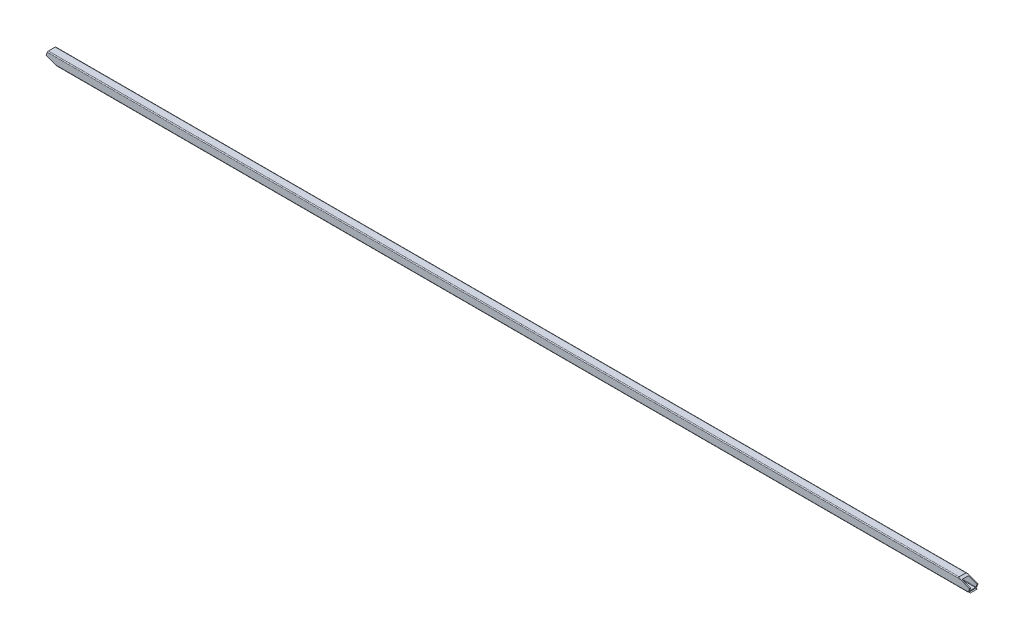
ISO-10303-21;
HEADER;
FILE_DESCRIPTION(('STEP AP214'),'2;1');
FILE_NAME('part.step','',(''),(''),'','','');
FILE_SCHEMA(('AUTOMOTIVE_DESIGN { 1 0 10303 214 1 1 1 1 }'));
ENDSEC;
DATA;
#1=APPLICATION_CONTEXT('core data for automotive mechanical design processes');
#2=APPLICATION_PROTOCOL_DEFINITION('international standard','automotive_design',2000,#1);
#3=PRODUCT_CONTEXT('',#1,'mechanical');
#4=PRODUCT('Part','Part','',(#3));
#5=PRODUCT_RELATED_PRODUCT_CATEGORY('part','',(#4));
#6=PRODUCT_DEFINITION_FORMATION('','',#4);
#7=PRODUCT_DEFINITION_CONTEXT('part definition',#1,'design');
#8=PRODUCT_DEFINITION('design','',#6,#7);
#9=PRODUCT_DEFINITION_SHAPE('','',#8);
#10=(LENGTH_UNIT() NAMED_UNIT(*) SI_UNIT(.MILLI.,.METRE.));
#11=(NAMED_UNIT(*) PLANE_ANGLE_UNIT() SI_UNIT($,.RADIAN.));
#12=(NAMED_UNIT(*) SI_UNIT($,.STERADIAN.) SOLID_ANGLE_UNIT());
#13=UNCERTAINTY_MEASURE_WITH_UNIT(LENGTH_MEASURE(1.E-05),#10,'distance_accuracy_value','');
#14=(GEOMETRIC_REPRESENTATION_CONTEXT(3) GLOBAL_UNCERTAINTY_ASSIGNED_CONTEXT((#13)) GLOBAL_UNIT_ASSIGNED_CONTEXT((#10,
#11,#12)) REPRESENTATION_CONTEXT('',''));
#15=CARTESIAN_POINT('',(0.,0.,0.));
#16=DIRECTION('',(0.,0.,1.));
#17=DIRECTION('',(1.,0.,0.));
#18=AXIS2_PLACEMENT_3D('',#15,#16,#17);
#19=CARTESIAN_POINT('',(-2786.03,12.7,-12.7));
#20=DIRECTION('',(0.,0.,-1.));
#21=DIRECTION('',(0.,1.,0.));
#22=AXIS2_PLACEMENT_3D('',#19,#20,#21);
#23=PLANE('',#22);
#24=DIRECTION('',(1.,0.,0.));
#25=VECTOR('',#24,1.);
#26=CARTESIAN_POINT('',(-2786.03,-10.2,-12.7));
#27=LINE('',#26,#25);
#28=CARTESIAN_POINT('',(-3.7406225324993,-10.2,-12.7));
#29=VERTEX_POINT('',#28);
#30=CARTESIAN_POINT('',(-2758.70655373482,-10.2000000000002,-12.7));
#31=VERTEX_POINT('',#30);
#32=EDGE_CURVE('E142',#29,#31,#27,.F.);
#33=ORIENTED_EDGE('',*,*,#32,.T.);
#34=DIRECTION('',(0.9366721892484,-0.350207381259461,0.));
#35=VECTOR('',#34,1.);
#36=CARTESIAN_POINT('',(-341.688045351741,-913.886190315629,-12.7));
#37=LINE('',#36,#35);
#38=CARTESIAN_POINT('',(-2786.03,0.0158179492779128,-12.7));
#39=VERTEX_POINT('',#38);
#40=EDGE_CURVE('E359',#39,#31,#37,.T.);
#41=ORIENTED_EDGE('',*,*,#40,.F.);
#42=DIRECTION('',(0.350207381259481,0.936672189248393,0.));
#43=VECTOR('',#42,1.);
#44=CARTESIAN_POINT('',(-2444.34195464822,913.902008264952,-12.7));
#45=LINE('',#44,#43);
#46=CARTESIAN_POINT('',(-2782.22229035815,10.2,-12.7));
#47=VERTEX_POINT('',#46);
#48=EDGE_CURVE('E320',#39,#47,#45,.T.);
#49=ORIENTED_EDGE('',*,*,#48,.T.);
#50=DIRECTION('',(1.,0.,0.));
#51=VECTOR('',#50,1.);
#52=CARTESIAN_POINT('',(-2786.03,10.2,-12.7));
#53=LINE('',#52,#51);
#54=CARTESIAN_POINT('',(-27.238832210926,10.2000000000001,-12.7));
#55=VERTEX_POINT('',#54);
#56=EDGE_CURVE('E158',#47,#55,#53,.T.);
#57=ORIENTED_EDGE('',*,*,#56,.T.);
#58=DIRECTION('',(-0.9366721892484,0.350207381259461,0.));
#59=VECTOR('',#58,1.);
#60=CARTESIAN_POINT('',(0.0051887542219442,0.0138779535687158,-12.7));
#61=LINE('',#60,#59);
#62=CARTESIAN_POINT('',(0.,0.0158179492779128,-12.7));
#63=VERTEX_POINT('',#62);
#64=EDGE_CURVE('E150',#63,#55,#61,.T.);
#65=ORIENTED_EDGE('',*,*,#64,.F.);
#66=DIRECTION('',(-0.343835113469539,-0.939030039320036,0.));
#67=VECTOR('',#66,1.);
#68=CARTESIAN_POINT('',(-0.00510716501219618,0.00187003885706116,-12.7));
#69=LINE('',#68,#67);
#70=EDGE_CURVE('E130',#63,#29,#69,.T.);
#71=ORIENTED_EDGE('',*,*,#70,.T.);
#72=EDGE_LOOP('',(#33,#41,#49,#57,#65,#71));
#73=FACE_BOUND('',#72,.T.);
#74=ADVANCED_FACE('F49',(#73),#23,.T.);
#75=CARTESIAN_POINT('',(-2786.03,12.7,12.7));
#76=DIRECTION('',(0.,0.,1.));
#77=DIRECTION('',(0.,-1.,0.));
#78=AXIS2_PLACEMENT_3D('',#75,#76,#77);
#79=PLANE('',#78);
#80=DIRECTION('',(0.350207381259481,0.936672189248393,0.));
#81=VECTOR('',#80,1.);
#82=CARTESIAN_POINT('',(-2444.34195464822,913.902008264952,12.7));
#83=LINE('',#82,#81);
#84=CARTESIAN_POINT('',(-2786.03,0.0158179492779128,12.7));
#85=VERTEX_POINT('',#84);
#86=CARTESIAN_POINT('',(-2782.22229035815,10.2,12.7));
#87=VERTEX_POINT('',#86);
#88=EDGE_CURVE('E324',#85,#87,#83,.T.);
#89=ORIENTED_EDGE('',*,*,#88,.F.);
#90=DIRECTION('',(0.9366721892484,-0.350207381259461,0.));
#91=VECTOR('',#90,1.);
#92=CARTESIAN_POINT('',(-341.688045351741,-913.886190315629,12.7));
#93=LINE('',#92,#91);
#94=CARTESIAN_POINT('',(-2758.70655373482,-10.2000000000002,12.7));
#95=VERTEX_POINT('',#94);
#96=EDGE_CURVE('E360',#85,#95,#93,.T.);
#97=ORIENTED_EDGE('',*,*,#96,.T.);
#98=DIRECTION('',(1.,0.,0.));
#99=VECTOR('',#98,1.);
#100=CARTESIAN_POINT('',(-2786.03,-10.2,12.7));
#101=LINE('',#100,#99);
#102=CARTESIAN_POINT('',(-3.7406225324993,-10.2,12.7));
#103=VERTEX_POINT('',#102);
#104=EDGE_CURVE('E258',#95,#103,#101,.T.);
#105=ORIENTED_EDGE('',*,*,#104,.T.);
#106=DIRECTION('',(-0.343835113469539,-0.939030039320036,0.));
#107=VECTOR('',#106,1.);
#108=CARTESIAN_POINT('',(-0.00510716501219618,0.00187003885706116,12.7));
#109=LINE('',#108,#107);
#110=CARTESIAN_POINT('',(0.,0.0158179492779128,12.7));
#111=VERTEX_POINT('',#110);
#112=EDGE_CURVE('E168',#111,#103,#109,.T.);
#113=ORIENTED_EDGE('',*,*,#112,.F.);
#114=DIRECTION('',(-0.9366721892484,0.350207381259461,0.));
#115=VECTOR('',#114,1.);
#116=CARTESIAN_POINT('',(0.0051887542219442,0.0138779535687158,12.7));
#117=LINE('',#116,#115);
#118=CARTESIAN_POINT('',(-27.238832210926,10.2000000000001,12.7));
#119=VERTEX_POINT('',#118);
#120=EDGE_CURVE('E164',#111,#119,#117,.T.);
#121=ORIENTED_EDGE('',*,*,#120,.T.);
#122=DIRECTION('',(1.,0.,0.));
#123=VECTOR('',#122,1.);
#124=CARTESIAN_POINT('',(-2786.03,10.2,12.7));
#125=LINE('',#124,#123);
#126=EDGE_CURVE('E261',#119,#87,#125,.F.);
#127=ORIENTED_EDGE('',*,*,#126,.T.);
#128=EDGE_LOOP('',(#89,#97,#105,#113,#121,#127));
#129=FACE_BOUND('',#128,.T.);
#130=ADVANCED_FACE('F274',(#129),#79,.T.);
#131=CARTESIAN_POINT('',(-2786.03,-9.652,-9.652));
#132=DIRECTION('',(0.,0.,-1.));
#133=DIRECTION('',(-1.,0.,0.));
#134=AXIS2_PLACEMENT_3D('',#131,#132,#133);
#135=PLANE('',#134);
#136=DIRECTION('',(-0.9366721892484,0.350207381259461,0.));
#137=VECTOR('',#136,1.);
#138=CARTESIAN_POINT('',(-2782.85867037187,-1.16989361227622,-9.652));
#139=LINE('',#138,#137);
#140=CARTESIAN_POINT('',(-2762.84686780742,-8.652,-9.652));
#141=VERTEX_POINT('',#140);
#142=CARTESIAN_POINT('',(-2786.03,0.0158179492779128,-9.652));
#143=VERTEX_POINT('',#142);
#144=EDGE_CURVE('E335',#141,#143,#139,.T.);
#145=ORIENTED_EDGE('',*,*,#144,.F.);
#146=DIRECTION('',(1.,0.,0.));
#147=VECTOR('',#146,1.);
#148=CARTESIAN_POINT('',(0.,-8.652,-9.652));
#149=LINE('',#148,#147);
#150=CARTESIAN_POINT('',(-3.17380705976289,-8.652,-9.652));
#151=VERTEX_POINT('',#150);
#152=EDGE_CURVE('E172',#141,#151,#149,.T.);
#153=ORIENTED_EDGE('',*,*,#152,.T.);
#154=DIRECTION('',(0.343835113469539,0.939030039320036,0.));
#155=VECTOR('',#154,1.);
#156=CARTESIAN_POINT('',(-332.493132081083,-908.038731050126,-9.652));
#157=LINE('',#156,#155);
#158=CARTESIAN_POINT('',(0.,0.0158179492779128,-9.652));
#159=VERTEX_POINT('',#158);
#160=EDGE_CURVE('E169',#151,#159,#157,.T.);
#161=ORIENTED_EDGE('',*,*,#160,.T.);
#162=DIRECTION('',(0.9366721892484,-0.350207381259461,0.));
#163=VECTOR('',#162,1.);
#164=CARTESIAN_POINT('',(-2441.16543626591,912.730174656922,-9.652));
#165=LINE('',#164,#163);
#166=CARTESIAN_POINT('',(-23.098518138327,8.652,-9.652));
#167=VERTEX_POINT('',#166);
#168=EDGE_CURVE('E153',#167,#159,#165,.T.);
#169=ORIENTED_EDGE('',*,*,#168,.F.);
#170=DIRECTION('',(1.,0.,0.));
#171=VECTOR('',#170,1.);
#172=CARTESIAN_POINT('',(-2786.03,8.652,-9.652));
#173=LINE('',#172,#171);
#174=CARTESIAN_POINT('',(-2782.80106384199,8.652,-9.652));
#175=VERTEX_POINT('',#174);
#176=EDGE_CURVE('E171',#167,#175,#173,.F.);
#177=ORIENTED_EDGE('',*,*,#176,.T.);
#178=DIRECTION('',(-0.350207381259481,-0.936672189248393,0.));
#179=VECTOR('',#178,1.);
#180=CARTESIAN_POINT('',(-2789.20132962813,-8.46628843844581,-9.652));
#181=LINE('',#180,#179);
#182=EDGE_CURVE('E291',#175,#143,#181,.T.);
#183=ORIENTED_EDGE('',*,*,#182,.T.);
#184=EDGE_LOOP('',(#145,#153,#161,#169,#177,#183));
#185=FACE_BOUND('',#184,.T.);
#186=ADVANCED_FACE('F430',(#185),#135,.F.);
#187=CARTESIAN_POINT('',(-2786.03,-9.652,9.652));
#188=DIRECTION('',(0.,0.,1.));
#189=DIRECTION('',(1.,0.,0.));
#190=AXIS2_PLACEMENT_3D('',#187,#188,#189);
#191=PLANE('',#190);
#192=DIRECTION('',(0.9366721892484,-0.350207381259461,0.));
#193=VECTOR('',#192,1.);
#194=CARTESIAN_POINT('',(-2782.85867037187,-1.16989361227622,9.652));
#195=LINE('',#194,#193);
#196=CARTESIAN_POINT('',(-2786.03,0.0158179492779128,9.65199999999999));
#197=VERTEX_POINT('',#196);
#198=CARTESIAN_POINT('',(-2762.84686780742,-8.652,9.652));
#199=VERTEX_POINT('',#198);
#200=EDGE_CURVE('E343',#197,#199,#195,.T.);
#201=ORIENTED_EDGE('',*,*,#200,.F.);
#202=DIRECTION('',(0.350207381259481,0.936672189248393,0.));
#203=VECTOR('',#202,1.);
#204=CARTESIAN_POINT('',(-2789.20132962813,-8.46628843844581,9.652));
#205=LINE('',#204,#203);
#206=CARTESIAN_POINT('',(-2782.80106384199,8.652,9.652));
#207=VERTEX_POINT('',#206);
#208=EDGE_CURVE('E305',#197,#207,#205,.T.);
#209=ORIENTED_EDGE('',*,*,#208,.T.);
#210=DIRECTION('',(1.,0.,0.));
#211=VECTOR('',#210,1.);
#212=CARTESIAN_POINT('',(0.,8.652,9.652));
#213=LINE('',#212,#211);
#214=CARTESIAN_POINT('',(-23.098518138327,8.652,9.652));
#215=VERTEX_POINT('',#214);
#216=EDGE_CURVE('E229',#207,#215,#213,.T.);
#217=ORIENTED_EDGE('',*,*,#216,.T.);
#218=DIRECTION('',(-0.9366721892484,0.350207381259461,0.));
#219=VECTOR('',#218,1.);
#220=CARTESIAN_POINT('',(-2441.16543626591,912.730174656922,9.652));
#221=LINE('',#220,#219);
#222=CARTESIAN_POINT('',(0.,0.0158179492779128,9.65199999999999));
#223=VERTEX_POINT('',#222);
#224=EDGE_CURVE('E187',#223,#215,#221,.T.);
#225=ORIENTED_EDGE('',*,*,#224,.F.);
#226=DIRECTION('',(-0.343835113469539,-0.939030039320036,0.));
#227=VECTOR('',#226,1.);
#228=CARTESIAN_POINT('',(-332.493132081083,-908.038731050126,9.652));
#229=LINE('',#228,#227);
#230=CARTESIAN_POINT('',(-3.17380705976289,-8.652,9.652));
#231=VERTEX_POINT('',#230);
#232=EDGE_CURVE('E178',#223,#231,#229,.T.);
#233=ORIENTED_EDGE('',*,*,#232,.T.);
#234=DIRECTION('',(1.,0.,0.));
#235=VECTOR('',#234,1.);
#236=CARTESIAN_POINT('',(-2786.03,-8.652,9.652));
#237=LINE('',#236,#235);
#238=EDGE_CURVE('E181',#231,#199,#237,.F.);
#239=ORIENTED_EDGE('',*,*,#238,.T.);
#240=EDGE_LOOP('',(#201,#209,#217,#225,#233,#239));
#241=FACE_BOUND('',#240,.T.);
#242=ADVANCED_FACE('F447',(#241),#191,.F.);
#243=CARTESIAN_POINT('',(-2786.03,-12.7,12.7));
#244=DIRECTION('',(0.,-1.,0.));
#245=DIRECTION('',(0.,0.,-1.));
#246=AXIS2_PLACEMENT_3D('',#243,#244,#245);
#247=PLANE('',#246);
#248=DIRECTION('',(1.,0.,0.));
#249=VECTOR('',#248,1.);
#250=CARTESIAN_POINT('',(-2786.03,-12.7,10.2));
#251=LINE('',#250,#249);
#252=CARTESIAN_POINT('',(-4.65602219777089,-12.7,10.2));
#253=VERTEX_POINT('',#252);
#254=CARTESIAN_POINT('',(-2752.02,-12.7000000000002,10.2));
#255=VERTEX_POINT('',#254);
#256=EDGE_CURVE('E192',#253,#255,#251,.F.);
#257=ORIENTED_EDGE('',*,*,#256,.T.);
#258=DIRECTION('',(0.,0.,1.));
#259=VECTOR('',#258,1.);
#260=CARTESIAN_POINT('',(-2752.02,-12.7000000000002,-12.7));
#261=LINE('',#260,#259);
#262=CARTESIAN_POINT('',(-2752.02,-12.7000000000002,-10.2));
#263=VERTEX_POINT('',#262);
#264=EDGE_CURVE('E355',#263,#255,#261,.T.);
#265=ORIENTED_EDGE('',*,*,#264,.F.);
#266=DIRECTION('',(1.,0.,0.));
#267=VECTOR('',#266,1.);
#268=CARTESIAN_POINT('',(-2786.03,-12.7,-10.2));
#269=LINE('',#268,#267);
#270=CARTESIAN_POINT('',(-4.65602219777089,-12.7,-10.2));
#271=VERTEX_POINT('',#270);
#272=EDGE_CURVE('E67',#263,#271,#269,.T.);
#273=ORIENTED_EDGE('',*,*,#272,.T.);
#274=DIRECTION('',(0.,0.,-1.));
#275=VECTOR('',#274,1.);
#276=CARTESIAN_POINT('',(-4.65602219777139,-12.7,12.7));
#277=LINE('',#276,#275);
#278=EDGE_CURVE('E59',#253,#271,#277,.T.);
#279=ORIENTED_EDGE('',*,*,#278,.F.);
#280=EDGE_LOOP('',(#257,#265,#273,#279));
#281=FACE_BOUND('',#280,.T.);
#282=ADVANCED_FACE('F51',(#281),#247,.T.);
#283=CARTESIAN_POINT('',(-2786.03,-9.652,9.652));
#284=DIRECTION('',(0.,-1.,0.));
#285=DIRECTION('',(0.,0.,-1.));
#286=AXIS2_PLACEMENT_3D('',#283,#284,#285);
#287=PLANE('',#286);
#288=DIRECTION('',(0.,0.,-1.));
#289=VECTOR('',#288,1.);
#290=CARTESIAN_POINT('',(-2760.17224631349,-9.652,9.652));
#291=LINE('',#290,#289);
#292=CARTESIAN_POINT('',(-2760.17224631349,-9.652,8.652));
#293=VERTEX_POINT('',#292);
#294=CARTESIAN_POINT('',(-2760.17224631349,-9.652,-8.652));
#295=VERTEX_POINT('',#294);
#296=EDGE_CURVE('E347',#293,#295,#291,.T.);
#297=ORIENTED_EDGE('',*,*,#296,.F.);
#298=DIRECTION('',(1.,0.,0.));
#299=VECTOR('',#298,1.);
#300=CARTESIAN_POINT('',(0.,-9.652,8.652));
#301=LINE('',#300,#299);
#302=CARTESIAN_POINT('',(-3.53996692587166,-9.652,8.652));
#303=VERTEX_POINT('',#302);
#304=EDGE_CURVE('E185',#293,#303,#301,.T.);
#305=ORIENTED_EDGE('',*,*,#304,.T.);
#306=DIRECTION('',(0.,0.,-1.));
#307=VECTOR('',#306,1.);
#308=CARTESIAN_POINT('',(-3.53996692587177,-9.652,9.652));
#309=LINE('',#308,#307);
#310=CARTESIAN_POINT('',(-3.53996692587177,-9.652,-8.652));
#311=VERTEX_POINT('',#310);
#312=EDGE_CURVE('E182',#303,#311,#309,.T.);
#313=ORIENTED_EDGE('',*,*,#312,.T.);
#314=DIRECTION('',(1.,0.,0.));
#315=VECTOR('',#314,1.);
#316=CARTESIAN_POINT('',(-2786.03,-9.652,-8.652));
#317=LINE('',#316,#315);
#318=EDGE_CURVE('E177',#311,#295,#317,.F.);
#319=ORIENTED_EDGE('',*,*,#318,.T.);
#320=EDGE_LOOP('',(#297,#305,#313,#319));
#321=FACE_BOUND('',#320,.T.);
#322=ADVANCED_FACE('F439',(#321),#287,.F.);
#323=CARTESIAN_POINT('',(-2786.03,-10.2,-10.2));
#324=DIRECTION('',(1.,0.,0.));
#325=DIRECTION('',(0.,0.,-1.));
#326=AXIS2_PLACEMENT_3D('',#323,#324,#325);
#327=CYLINDRICAL_SURFACE('',#326,2.5);
#328=ORIENTED_EDGE('',*,*,#272,.F.);
#329=CARTESIAN_POINT('',(-2758.70655373482,-10.2,-10.2));
#330=DIRECTION('',(-0.350207381259461,-0.9366721892484,0.));
#331=DIRECTION('',(0.9366721892484,-0.350207381259461,0.));
#332=AXIS2_PLACEMENT_3D('',#329,#330,#331);
#333=ELLIPSE('',#332,7.13862737846694,2.5);
#334=EDGE_CURVE('E326',#263,#31,#333,.F.);
#335=ORIENTED_EDGE('',*,*,#334,.T.);
#336=ORIENTED_EDGE('',*,*,#32,.F.);
#337=CARTESIAN_POINT('',(-3.74062253249896,-10.2,-10.2));
#338=DIRECTION('',(-0.939030039320036,0.343835113469539,0.));
#339=DIRECTION('',(0.343835113469539,0.939030039320036,0.));
#340=AXIS2_PLACEMENT_3D('',#337,#338,#339);
#341=ELLIPSE('',#340,2.66232164607884,2.5);
#342=EDGE_CURVE('E137',#271,#29,#341,.F.);
#343=ORIENTED_EDGE('',*,*,#342,.F.);
#344=EDGE_LOOP('',(#328,#335,#336,#343));
#345=FACE_BOUND('',#344,.T.);
#346=ADVANCED_FACE('F378',(#345),#327,.T.);
#347=CARTESIAN_POINT('',(-2786.03,-10.2,10.2));
#348=DIRECTION('',(1.,0.,0.));
#349=DIRECTION('',(0.,0.,-1.));
#350=AXIS2_PLACEMENT_3D('',#347,#348,#349);
#351=CYLINDRICAL_SURFACE('',#350,2.5);
#352=ORIENTED_EDGE('',*,*,#104,.F.);
#353=CARTESIAN_POINT('',(-2758.70655373482,-10.2,10.2));
#354=DIRECTION('',(-0.350207381259461,-0.9366721892484,0.));
#355=DIRECTION('',(0.9366721892484,-0.350207381259461,0.));
#356=AXIS2_PLACEMENT_3D('',#353,#354,#355);
#357=ELLIPSE('',#356,7.13862737846694,2.5);
#358=EDGE_CURVE('E332',#95,#255,#357,.F.);
#359=ORIENTED_EDGE('',*,*,#358,.T.);
#360=ORIENTED_EDGE('',*,*,#256,.F.);
#361=CARTESIAN_POINT('',(-3.74062253249896,-10.2,10.2));
#362=DIRECTION('',(-0.939030039320036,0.343835113469539,0.));
#363=DIRECTION('',(0.343835113469539,0.939030039320036,0.));
#364=AXIS2_PLACEMENT_3D('',#361,#362,#363);
#365=ELLIPSE('',#364,2.66232164607884,2.5);
#366=EDGE_CURVE('E166',#103,#253,#365,.F.);
#367=ORIENTED_EDGE('',*,*,#366,.F.);
#368=EDGE_LOOP('',(#352,#359,#360,#367));
#369=FACE_BOUND('',#368,.T.);
#370=ADVANCED_FACE('F467',(#369),#351,.T.);
#371=CARTESIAN_POINT('',(-2786.03,-8.652,-8.652));
#372=DIRECTION('',(-1.,0.,0.));
#373=DIRECTION('',(0.,0.,1.));
#374=AXIS2_PLACEMENT_3D('',#371,#372,#373);
#375=CYLINDRICAL_SURFACE('',#374,1.);
#376=CARTESIAN_POINT('',(-2762.84686780742,-8.652,-8.652));
#377=DIRECTION('',(-0.350207381259461,-0.9366721892484,0.));
#378=DIRECTION('',(-0.9366721892484,0.350207381259461,0.));
#379=AXIS2_PLACEMENT_3D('',#376,#377,#378);
#380=ELLIPSE('',#379,2.85545095138677,1.);
#381=EDGE_CURVE('E339',#295,#141,#380,.F.);
#382=ORIENTED_EDGE('',*,*,#381,.F.);
#383=ORIENTED_EDGE('',*,*,#318,.F.);
#384=CARTESIAN_POINT('',(-3.17380705976289,-8.652,-8.652));
#385=DIRECTION('',(-0.939030039320036,0.343835113469539,0.));
#386=DIRECTION('',(-0.343835113469539,-0.939030039320036,0.));
#387=AXIS2_PLACEMENT_3D('',#384,#385,#386);
#388=ELLIPSE('',#387,1.06492865843154,1.);
#389=EDGE_CURVE('E173',#311,#151,#388,.F.);
#390=ORIENTED_EDGE('',*,*,#389,.T.);
#391=ORIENTED_EDGE('',*,*,#152,.F.);
#392=EDGE_LOOP('',(#382,#383,#390,#391));
#393=FACE_BOUND('',#392,.T.);
#394=ADVANCED_FACE('F436',(#393),#375,.F.);
#395=CARTESIAN_POINT('',(-2786.03,-8.652,8.652));
#396=DIRECTION('',(-1.,0.,0.));
#397=DIRECTION('',(0.,0.,1.));
#398=AXIS2_PLACEMENT_3D('',#395,#396,#397);
#399=CYLINDRICAL_SURFACE('',#398,1.);
#400=CARTESIAN_POINT('',(-2762.84686780742,-8.652,8.652));
#401=DIRECTION('',(-0.350207381259461,-0.9366721892484,0.));
#402=DIRECTION('',(-0.9366721892484,0.350207381259461,0.));
#403=AXIS2_PLACEMENT_3D('',#400,#401,#402);
#404=ELLIPSE('',#403,2.85545095138677,1.);
#405=EDGE_CURVE('E351',#199,#293,#404,.F.);
#406=ORIENTED_EDGE('',*,*,#405,.F.);
#407=ORIENTED_EDGE('',*,*,#238,.F.);
#408=CARTESIAN_POINT('',(-3.17380705976289,-8.652,8.652));
#409=DIRECTION('',(-0.939030039320036,0.343835113469539,0.));
#410=DIRECTION('',(-0.343835113469539,-0.939030039320036,0.));
#411=AXIS2_PLACEMENT_3D('',#408,#409,#410);
#412=ELLIPSE('',#411,1.06492865843154,1.);
#413=EDGE_CURVE('E176',#231,#303,#412,.F.);
#414=ORIENTED_EDGE('',*,*,#413,.T.);
#415=ORIENTED_EDGE('',*,*,#304,.F.);
#416=EDGE_LOOP('',(#406,#407,#414,#415));
#417=FACE_BOUND('',#416,.T.);
#418=ADVANCED_FACE('F444',(#417),#399,.F.);
#419=CARTESIAN_POINT('',(-2786.03,12.7,12.7));
#420=DIRECTION('',(0.,1.,0.));
#421=DIRECTION('',(0.,0.,1.));
#422=AXIS2_PLACEMENT_3D('',#419,#420,#421);
#423=PLANE('',#422);
#424=DIRECTION('',(0.,0.,1.));
#425=VECTOR('',#424,1.);
#426=CARTESIAN_POINT('',(-2781.28757865944,12.6999999999999,-12.7));
#427=LINE('',#426,#425);
#428=CARTESIAN_POINT('',(-2781.28757865944,12.6999999999999,-10.2));
#429=VERTEX_POINT('',#428);
#430=CARTESIAN_POINT('',(-2781.28757865944,12.6999999999999,10.2));
#431=VERTEX_POINT('',#430);
#432=EDGE_CURVE('E318',#429,#431,#427,.T.);
#433=ORIENTED_EDGE('',*,*,#432,.T.);
#434=DIRECTION('',(1.,0.,0.));
#435=VECTOR('',#434,1.);
#436=CARTESIAN_POINT('',(-2786.03,12.7,10.2));
#437=LINE('',#436,#435);
#438=CARTESIAN_POINT('',(-33.9253859457433,12.7,10.2));
#439=VERTEX_POINT('',#438);
#440=EDGE_CURVE('E255',#431,#439,#437,.T.);
#441=ORIENTED_EDGE('',*,*,#440,.T.);
#442=DIRECTION('',(0.,0.,-1.));
#443=VECTOR('',#442,1.);
#444=CARTESIAN_POINT('',(-33.9253859457433,12.7,12.7));
#445=LINE('',#444,#443);
#446=CARTESIAN_POINT('',(-33.9253859457433,12.7,-10.2));
#447=VERTEX_POINT('',#446);
#448=EDGE_CURVE('E211',#439,#447,#445,.T.);
#449=ORIENTED_EDGE('',*,*,#448,.T.);
#450=DIRECTION('',(1.,0.,0.));
#451=VECTOR('',#450,1.);
#452=CARTESIAN_POINT('',(-2786.03,12.7,-10.2));
#453=LINE('',#452,#451);
#454=EDGE_CURVE('E248',#447,#429,#453,.F.);
#455=ORIENTED_EDGE('',*,*,#454,.T.);
#456=EDGE_LOOP('',(#433,#441,#449,#455));
#457=FACE_BOUND('',#456,.T.);
#458=ADVANCED_FACE('F485',(#457),#423,.T.);
#459=CARTESIAN_POINT('',(-2786.03,9.652,9.652));
#460=DIRECTION('',(0.,1.,0.));
#461=DIRECTION('',(0.,0.,1.));
#462=AXIS2_PLACEMENT_3D('',#459,#460,#461);
#463=PLANE('',#462);
#464=DIRECTION('',(1.,0.,0.));
#465=VECTOR('',#464,1.);
#466=CARTESIAN_POINT('',(-2786.03,9.652,8.652));
#467=LINE('',#466,#465);
#468=CARTESIAN_POINT('',(-25.7731396322538,9.652,8.652));
#469=VERTEX_POINT('',#468);
#470=CARTESIAN_POINT('',(-2782.42717916251,9.652,8.652));
#471=VERTEX_POINT('',#470);
#472=EDGE_CURVE('E232',#469,#471,#467,.F.);
#473=ORIENTED_EDGE('',*,*,#472,.T.);
#474=DIRECTION('',(0.,0.,-1.));
#475=VECTOR('',#474,1.);
#476=CARTESIAN_POINT('',(-2782.42717916251,9.652,9.652));
#477=LINE('',#476,#475);
#478=CARTESIAN_POINT('',(-2782.42717916251,9.652,-8.652));
#479=VERTEX_POINT('',#478);
#480=EDGE_CURVE('E309',#471,#479,#477,.T.);
#481=ORIENTED_EDGE('',*,*,#480,.T.);
#482=DIRECTION('',(1.,0.,0.));
#483=VECTOR('',#482,1.);
#484=CARTESIAN_POINT('',(0.,9.652,-8.652));
#485=LINE('',#484,#483);
#486=CARTESIAN_POINT('',(-25.7731396322538,9.652,-8.652));
#487=VERTEX_POINT('',#486);
#488=EDGE_CURVE('E208',#479,#487,#485,.T.);
#489=ORIENTED_EDGE('',*,*,#488,.T.);
#490=DIRECTION('',(0.,0.,-1.));
#491=VECTOR('',#490,1.);
#492=CARTESIAN_POINT('',(-25.7731396322538,9.652,9.652));
#493=LINE('',#492,#491);
#494=EDGE_CURVE('E214',#469,#487,#493,.T.);
#495=ORIENTED_EDGE('',*,*,#494,.F.);
#496=EDGE_LOOP('',(#473,#481,#489,#495));
#497=FACE_BOUND('',#496,.T.);
#498=ADVANCED_FACE('F456',(#497),#463,.F.);
#499=CARTESIAN_POINT('',(-2786.03,10.2,-10.2));
#500=DIRECTION('',(1.,0.,0.));
#501=DIRECTION('',(0.,0.,-1.));
#502=AXIS2_PLACEMENT_3D('',#499,#500,#501);
#503=CYLINDRICAL_SURFACE('',#502,2.5);
#504=CARTESIAN_POINT('',(-2782.22229035815,10.2,-10.2));
#505=DIRECTION('',(0.936672189248392,-0.350207381259481,0.));
#506=DIRECTION('',(0.350207381259481,0.936672189248393,0.));
#507=AXIS2_PLACEMENT_3D('',#504,#505,#506);
#508=ELLIPSE('',#507,2.66902340935953,2.5);
#509=EDGE_CURVE('E143',#429,#47,#508,.F.);
#510=ORIENTED_EDGE('',*,*,#509,.F.);
#511=ORIENTED_EDGE('',*,*,#454,.F.);
#512=CARTESIAN_POINT('',(-27.238832210926,10.2,-10.2));
#513=DIRECTION('',(0.350207381259461,0.9366721892484,0.));
#514=DIRECTION('',(0.9366721892484,-0.350207381259461,0.));
#515=AXIS2_PLACEMENT_3D('',#512,#513,#514);
#516=ELLIPSE('',#515,7.13862737846694,2.5);
#517=EDGE_CURVE('E201',#447,#55,#516,.F.);
#518=ORIENTED_EDGE('',*,*,#517,.T.);
#519=ORIENTED_EDGE('',*,*,#56,.F.);
#520=EDGE_LOOP('',(#510,#511,#518,#519));
#521=FACE_BOUND('',#520,.T.);
#522=ADVANCED_FACE('F483',(#521),#503,.T.);
#523=CARTESIAN_POINT('',(-2786.03,10.2,10.2));
#524=DIRECTION('',(1.,0.,0.));
#525=DIRECTION('',(0.,0.,-1.));
#526=AXIS2_PLACEMENT_3D('',#523,#524,#525);
#527=CYLINDRICAL_SURFACE('',#526,2.5);
#528=CARTESIAN_POINT('',(-2782.22229035815,10.2,10.2));
#529=DIRECTION('',(0.936672189248392,-0.350207381259481,0.));
#530=DIRECTION('',(0.350207381259481,0.936672189248393,0.));
#531=AXIS2_PLACEMENT_3D('',#528,#529,#530);
#532=ELLIPSE('',#531,2.66902340935953,2.5);
#533=EDGE_CURVE('E280',#87,#431,#532,.F.);
#534=ORIENTED_EDGE('',*,*,#533,.F.);
#535=ORIENTED_EDGE('',*,*,#126,.F.);
#536=CARTESIAN_POINT('',(-27.238832210926,10.2,10.2));
#537=DIRECTION('',(0.350207381259461,0.9366721892484,0.));
#538=DIRECTION('',(0.9366721892484,-0.350207381259461,0.));
#539=AXIS2_PLACEMENT_3D('',#536,#537,#538);
#540=ELLIPSE('',#539,7.13862737846694,2.5);
#541=EDGE_CURVE('E195',#119,#439,#540,.F.);
#542=ORIENTED_EDGE('',*,*,#541,.T.);
#543=ORIENTED_EDGE('',*,*,#440,.F.);
#544=EDGE_LOOP('',(#534,#535,#542,#543));
#545=FACE_BOUND('',#544,.T.);
#546=ADVANCED_FACE('F278',(#545),#527,.T.);
#547=CARTESIAN_POINT('',(-2786.03,8.652,-8.652));
#548=DIRECTION('',(-1.,0.,0.));
#549=DIRECTION('',(0.,0.,1.));
#550=AXIS2_PLACEMENT_3D('',#547,#548,#549);
#551=CYLINDRICAL_SURFACE('',#550,1.);
#552=ORIENTED_EDGE('',*,*,#488,.F.);
#553=CARTESIAN_POINT('',(-2782.80106384199,8.652,-8.652));
#554=DIRECTION('',(0.936672189248392,-0.350207381259481,0.));
#555=DIRECTION('',(-0.350207381259481,-0.936672189248393,0.));
#556=AXIS2_PLACEMENT_3D('',#553,#554,#555);
#557=ELLIPSE('',#556,1.06760936374381,1.);
#558=EDGE_CURVE('E299',#479,#175,#557,.F.);
#559=ORIENTED_EDGE('',*,*,#558,.T.);
#560=ORIENTED_EDGE('',*,*,#176,.F.);
#561=CARTESIAN_POINT('',(-23.098518138327,8.652,-8.652));
#562=DIRECTION('',(0.350207381259461,0.9366721892484,0.));
#563=DIRECTION('',(-0.9366721892484,0.350207381259461,0.));
#564=AXIS2_PLACEMENT_3D('',#561,#562,#563);
#565=ELLIPSE('',#564,2.85545095138677,1.);
#566=EDGE_CURVE('E161',#487,#167,#565,.F.);
#567=ORIENTED_EDGE('',*,*,#566,.F.);
#568=EDGE_LOOP('',(#552,#559,#560,#567));
#569=FACE_BOUND('',#568,.T.);
#570=ADVANCED_FACE('F429',(#569),#551,.F.);
#571=CARTESIAN_POINT('',(-2786.03,8.652,8.652));
#572=DIRECTION('',(-1.,0.,0.));
#573=DIRECTION('',(0.,0.,1.));
#574=AXIS2_PLACEMENT_3D('',#571,#572,#573);
#575=CYLINDRICAL_SURFACE('',#574,1.);
#576=ORIENTED_EDGE('',*,*,#216,.F.);
#577=CARTESIAN_POINT('',(-2782.80106384199,8.652,8.652));
#578=DIRECTION('',(0.936672189248392,-0.350207381259481,0.));
#579=DIRECTION('',(-0.350207381259481,-0.936672189248393,0.));
#580=AXIS2_PLACEMENT_3D('',#577,#578,#579);
#581=ELLIPSE('',#580,1.06760936374381,1.);
#582=EDGE_CURVE('E313',#207,#471,#581,.F.);
#583=ORIENTED_EDGE('',*,*,#582,.T.);
#584=ORIENTED_EDGE('',*,*,#472,.F.);
#585=CARTESIAN_POINT('',(-23.098518138327,8.652,8.652));
#586=DIRECTION('',(0.350207381259461,0.9366721892484,0.));
#587=DIRECTION('',(-0.9366721892484,0.350207381259461,0.));
#588=AXIS2_PLACEMENT_3D('',#585,#586,#587);
#589=ELLIPSE('',#588,2.85545095138677,1.);
#590=EDGE_CURVE('E218',#215,#469,#589,.F.);
#591=ORIENTED_EDGE('',*,*,#590,.F.);
#592=EDGE_LOOP('',(#576,#583,#584,#591));
#593=FACE_BOUND('',#592,.T.);
#594=ADVANCED_FACE('F454',(#593),#575,.F.);
#595=CARTESIAN_POINT('',(0.0051887542219442,0.0138779535687158,-12.7));
#596=DIRECTION('',(0.350207381259461,0.9366721892484,0.));
#597=DIRECTION('',(-0.9366721892484,0.350207381259461,0.));
#598=AXIS2_PLACEMENT_3D('',#595,#596,#597);
#599=PLANE('',#598);
#600=ORIENTED_EDGE('',*,*,#448,.F.);
#601=ORIENTED_EDGE('',*,*,#541,.F.);
#602=ORIENTED_EDGE('',*,*,#120,.F.);
#603=DIRECTION('',(0.,0.,1.));
#604=VECTOR('',#603,1.);
#605=CARTESIAN_POINT('',(0.,0.0158179492779128,-12.7));
#606=LINE('',#605,#604);
#607=EDGE_CURVE('E154',#223,#111,#606,.T.);
#608=ORIENTED_EDGE('',*,*,#607,.F.);
#609=ORIENTED_EDGE('',*,*,#224,.T.);
#610=ORIENTED_EDGE('',*,*,#590,.T.);
#611=ORIENTED_EDGE('',*,*,#494,.T.);
#612=ORIENTED_EDGE('',*,*,#566,.T.);
#613=ORIENTED_EDGE('',*,*,#168,.T.);
#614=EDGE_CURVE('E134',#63,#159,#606,.T.);
#615=ORIENTED_EDGE('',*,*,#614,.F.);
#616=ORIENTED_EDGE('',*,*,#64,.T.);
#617=ORIENTED_EDGE('',*,*,#517,.F.);
#618=EDGE_LOOP('',(#600,#601,#602,#608,#609,#610,#611,#612,#613,#615,#616,#617));
#619=FACE_BOUND('',#618,.T.);
#620=ADVANCED_FACE('F149',(#619),#599,.T.);
#621=CARTESIAN_POINT('',(-0.00510716501219618,0.00187003885706116,-12.7));
#622=DIRECTION('',(-0.939030039320036,0.343835113469539,0.));
#623=DIRECTION('',(-0.343835113469539,-0.939030039320036,0.));
#624=AXIS2_PLACEMENT_3D('',#621,#622,#623);
#625=PLANE('',#624);
#626=ORIENTED_EDGE('',*,*,#342,.T.);
#627=ORIENTED_EDGE('',*,*,#70,.F.);
#628=ORIENTED_EDGE('',*,*,#614,.T.);
#629=ORIENTED_EDGE('',*,*,#160,.F.);
#630=ORIENTED_EDGE('',*,*,#389,.F.);
#631=ORIENTED_EDGE('',*,*,#312,.F.);
#632=ORIENTED_EDGE('',*,*,#413,.F.);
#633=ORIENTED_EDGE('',*,*,#232,.F.);
#634=ORIENTED_EDGE('',*,*,#607,.T.);
#635=ORIENTED_EDGE('',*,*,#112,.T.);
#636=ORIENTED_EDGE('',*,*,#366,.T.);
#637=ORIENTED_EDGE('',*,*,#278,.T.);
#638=EDGE_LOOP('',(#626,#627,#628,#629,#630,#631,#632,#633,#634,#635,#636,#637));
#639=FACE_BOUND('',#638,.T.);
#640=ADVANCED_FACE('F132',(#639),#625,.F.);
#641=CARTESIAN_POINT('',(-2444.34195464822,913.902008264952,-12.7));
#642=DIRECTION('',(0.936672189248392,-0.350207381259481,0.));
#643=DIRECTION('',(0.350207381259481,0.936672189248393,0.));
#644=AXIS2_PLACEMENT_3D('',#641,#642,#643);
#645=PLANE('',#644);
#646=ORIENTED_EDGE('',*,*,#509,.T.);
#647=ORIENTED_EDGE('',*,*,#48,.F.);
#648=DIRECTION('',(0.,0.,1.));
#649=VECTOR('',#648,1.);
#650=CARTESIAN_POINT('',(-2786.03,0.0158179492779128,-12.7));
#651=LINE('',#650,#649);
#652=EDGE_CURVE('E317',#39,#143,#651,.T.);
#653=ORIENTED_EDGE('',*,*,#652,.T.);
#654=ORIENTED_EDGE('',*,*,#182,.F.);
#655=ORIENTED_EDGE('',*,*,#558,.F.);
#656=ORIENTED_EDGE('',*,*,#480,.F.);
#657=ORIENTED_EDGE('',*,*,#582,.F.);
#658=ORIENTED_EDGE('',*,*,#208,.F.);
#659=DIRECTION('',(0.,0.,-1.));
#660=VECTOR('',#659,1.);
#661=CARTESIAN_POINT('',(-2786.03,0.01581794927795,0.));
#662=LINE('',#661,#660);
#663=EDGE_CURVE('E12',#85,#197,#662,.T.);
#664=ORIENTED_EDGE('',*,*,#663,.F.);
#665=ORIENTED_EDGE('',*,*,#88,.T.);
#666=ORIENTED_EDGE('',*,*,#533,.T.);
#667=ORIENTED_EDGE('',*,*,#432,.F.);
#668=EDGE_LOOP('',(#646,#647,#653,#654,#655,#656,#657,#658,#664,#665,#666,#667));
#669=FACE_BOUND('',#668,.T.);
#670=ADVANCED_FACE('F423',(#669),#645,.F.);
#671=CARTESIAN_POINT('',(-341.688045351741,-913.886190315629,-12.7));
#672=DIRECTION('',(-0.350207381259461,-0.9366721892484,0.));
#673=DIRECTION('',(0.9366721892484,-0.350207381259461,0.));
#674=AXIS2_PLACEMENT_3D('',#671,#672,#673);
#675=PLANE('',#674);
#676=ORIENTED_EDGE('',*,*,#264,.T.);
#677=ORIENTED_EDGE('',*,*,#358,.F.);
#678=ORIENTED_EDGE('',*,*,#96,.F.);
#679=ORIENTED_EDGE('',*,*,#663,.T.);
#680=ORIENTED_EDGE('',*,*,#200,.T.);
#681=ORIENTED_EDGE('',*,*,#405,.T.);
#682=ORIENTED_EDGE('',*,*,#296,.T.);
#683=ORIENTED_EDGE('',*,*,#381,.T.);
#684=ORIENTED_EDGE('',*,*,#144,.T.);
#685=ORIENTED_EDGE('',*,*,#652,.F.);
#686=ORIENTED_EDGE('',*,*,#40,.T.);
#687=ORIENTED_EDGE('',*,*,#334,.F.);
#688=EDGE_LOOP('',(#676,#677,#678,#679,#680,#681,#682,#683,#684,#685,#686,#687));
#689=FACE_BOUND('',#688,.T.);
#690=ADVANCED_FACE('F370',(#689),#675,.T.);
#691=CLOSED_SHELL('',(#74,#130,#186,#242,#282,#322,#346,#370,#394,#418,#458,#498,#522,#546,#570,
#594,#620,#640,#670,#690));
#692=MANIFOLD_SOLID_BREP('B2',#691);
#693=CARTESIAN_POINT('',(-2786.03,-10.2,-10.2));
#694=DIRECTION('',(1.,0.,0.));
#695=DIRECTION('',(0.,0.,-1.));
#696=AXIS2_PLACEMENT_3D('',#693,#694,#695);
#697=CYLINDRICAL_SURFACE('',#696,2.5);
#698=CARTESIAN_POINT('',(363.282175413044,-10.2,-10.2));
#699=DIRECTION('',(0.006794462520244,-0.999976917373127,0.));
#700=DIRECTION('',(0.999976917373127,0.006794462520244,0.));
#701=AXIS2_PLACEMENT_3D('',#698,#699,#700);
#702=ELLIPSE('',#701,367.946690786988,2.5);
#703=CARTESIAN_POINT('',(0.,-12.6683641014442,-10.5964576430108));
#704=VERTEX_POINT('',#703);
#705=CARTESIAN_POINT('',(-4.65602219777089,-12.7,-10.2));
#706=VERTEX_POINT('',#705);
#707=EDGE_CURVE('E679',#704,#706,#702,.F.);
#708=ORIENTED_EDGE('',*,*,#707,.F.);
#709=CARTESIAN_POINT('',(0.,-10.2,-10.2));
#710=DIRECTION('',(1.,0.,0.));
#711=DIRECTION('',(0.,0.,-1.));
#712=AXIS2_PLACEMENT_3D('',#709,#710,#711);
#713=CIRCLE('',#712,2.5);
#714=CARTESIAN_POINT('',(0.,-12.7,-10.2));
#715=VERTEX_POINT('',#714);
#716=EDGE_CURVE('E654',#715,#704,#713,.T.);
#717=ORIENTED_EDGE('',*,*,#716,.F.);
#718=DIRECTION('',(1.,0.,0.));
#719=VECTOR('',#718,1.);
#720=CARTESIAN_POINT('',(-2786.03,-12.7,-10.2));
#721=LINE('',#720,#719);
#722=EDGE_CURVE('E667',#706,#715,#721,.T.);
#723=ORIENTED_EDGE('',*,*,#722,.F.);
#724=EDGE_LOOP('',(#708,#717,#723));
#725=FACE_BOUND('',#724,.T.);
#726=ADVANCED_FACE('F646',(#725),#697,.T.);
#727=CARTESIAN_POINT('',(-2786.03,-10.2,10.2));
#728=DIRECTION('',(1.,0.,0.));
#729=DIRECTION('',(0.,0.,-1.));
#730=AXIS2_PLACEMENT_3D('',#727,#728,#729);
#731=CYLINDRICAL_SURFACE('',#730,2.5);
#732=CARTESIAN_POINT('',(363.282175413045,-10.2,10.2));
#733=DIRECTION('',(0.006794462520244,-0.999976917373127,0.));
#734=DIRECTION('',(0.999976917373127,0.006794462520244,0.));
#735=AXIS2_PLACEMENT_3D('',#732,#733,#734);
#736=ELLIPSE('',#735,367.946690786988,2.5);
#737=CARTESIAN_POINT('',(-4.65602219777095,-12.7,10.2));
#738=VERTEX_POINT('',#737);
#739=CARTESIAN_POINT('',(0.,-12.6683641014442,10.5964576430107));
#740=VERTEX_POINT('',#739);
#741=EDGE_CURVE('E47',#738,#740,#736,.F.);
#742=ORIENTED_EDGE('',*,*,#741,.F.);
#743=DIRECTION('',(1.,0.,0.));
#744=VECTOR('',#743,1.);
#745=CARTESIAN_POINT('',(-2786.03,-12.7,10.2));
#746=LINE('',#745,#744);
#747=CARTESIAN_POINT('',(0.,-12.7,10.2));
#748=VERTEX_POINT('',#747);
#749=EDGE_CURVE('E689',#748,#738,#746,.F.);
#750=ORIENTED_EDGE('',*,*,#749,.F.);
#751=CARTESIAN_POINT('',(0.,-10.2,10.2));
#752=DIRECTION('',(1.,0.,0.));
#753=DIRECTION('',(0.,0.,-1.));
#754=AXIS2_PLACEMENT_3D('',#751,#752,#753);
#755=CIRCLE('',#754,2.5);
#756=EDGE_CURVE('E693',#740,#748,#755,.T.);
#757=ORIENTED_EDGE('',*,*,#756,.F.);
#758=EDGE_LOOP('',(#742,#750,#757));
#759=FACE_BOUND('',#758,.T.);
#760=ADVANCED_FACE('F648',(#759),#731,.T.);
#761=CARTESIAN_POINT('',(-2786.03,-12.7,12.7));
#762=DIRECTION('',(0.,-1.,0.));
#763=DIRECTION('',(0.,0.,-1.));
#764=AXIS2_PLACEMENT_3D('',#761,#762,#763);
#765=PLANE('',#764);
#766=ORIENTED_EDGE('',*,*,#749,.T.);
#767=DIRECTION('',(0.,0.,1.));
#768=VECTOR('',#767,1.);
#769=CARTESIAN_POINT('',(-4.65602219777112,-12.7,-12.7));
#770=LINE('',#769,#768);
#771=EDGE_CURVE('E660',#706,#738,#770,.T.);
#772=ORIENTED_EDGE('',*,*,#771,.F.);
#773=ORIENTED_EDGE('',*,*,#722,.T.);
#774=DIRECTION('',(0.,0.,-1.));
#775=VECTOR('',#774,1.);
#776=CARTESIAN_POINT('',(0.,-12.7,12.7));
#777=LINE('',#776,#775);
#778=EDGE_CURVE('E685',#748,#715,#777,.T.);
#779=ORIENTED_EDGE('',*,*,#778,.F.);
#780=EDGE_LOOP('',(#766,#772,#773,#779));
#781=FACE_BOUND('',#780,.T.);
#782=ADVANCED_FACE('F687',(#781),#765,.T.);
#783=CARTESIAN_POINT('',(0.,0.,0.));
#784=DIRECTION('',(1.,0.,0.));
#785=DIRECTION('',(0.,0.,-1.));
#786=AXIS2_PLACEMENT_3D('',#783,#784,#785);
#787=PLANE('',#786);
#788=DIRECTION('',(0.,0.,1.));
#789=VECTOR('',#788,1.);
#790=CARTESIAN_POINT('',(0.,-12.6683641014442,-12.7));
#791=LINE('',#790,#789);
#792=EDGE_CURVE('E682',#704,#740,#791,.T.);
#793=ORIENTED_EDGE('',*,*,#792,.T.);
#794=ORIENTED_EDGE('',*,*,#756,.T.);
#795=ORIENTED_EDGE('',*,*,#778,.T.);
#796=ORIENTED_EDGE('',*,*,#716,.T.);
#797=EDGE_LOOP('',(#793,#794,#795,#796));
#798=FACE_BOUND('',#797,.T.);
#799=ADVANCED_FACE('F699',(#798),#787,.T.);
#800=CARTESIAN_POINT('',(0.0860727382493047,-12.6677792699507,-12.7));
#801=DIRECTION('',(0.006794462520244,-0.999976917373127,0.));
#802=DIRECTION('',(0.999976917373127,0.006794462520244,0.));
#803=AXIS2_PLACEMENT_3D('',#800,#801,#802);
#804=PLANE('',#803);
#805=ORIENTED_EDGE('',*,*,#707,.T.);
#806=ORIENTED_EDGE('',*,*,#771,.T.);
#807=ORIENTED_EDGE('',*,*,#741,.T.);
#808=ORIENTED_EDGE('',*,*,#792,.F.);
#809=EDGE_LOOP('',(#805,#806,#807,#808));
#810=FACE_BOUND('',#809,.T.);
#811=ADVANCED_FACE('F680',(#810),#804,.F.);
#812=CLOSED_SHELL('',(#726,#760,#782,#799,#811));
#813=MANIFOLD_SOLID_BREP('B6',#812);
#814=ADVANCED_BREP_SHAPE_REPRESENTATION('',(#18,#692,#813),#14);
#815=SHAPE_DEFINITION_REPRESENTATION(#9,#814);
ENDSEC;
END-ISO-10303-21;
